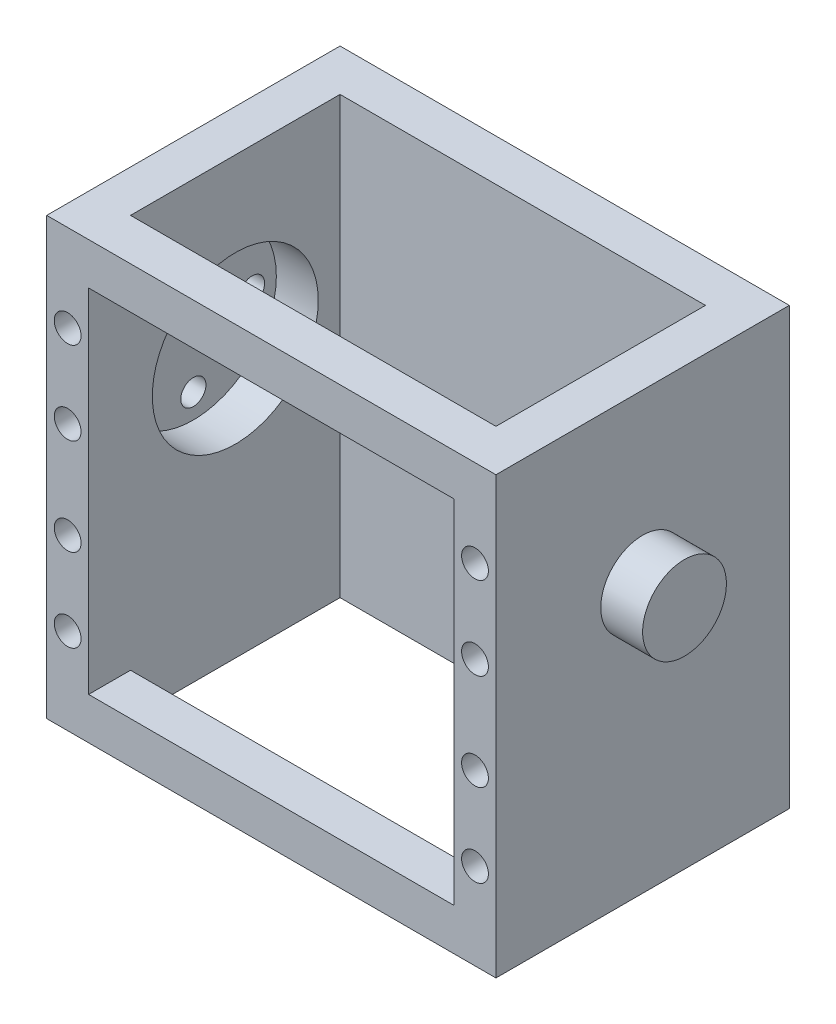
ISO-10303-21;
HEADER;
FILE_DESCRIPTION(('STEP AP214'),'2;1');
FILE_NAME('part.step','',(''),(''),'','','');
FILE_SCHEMA(('AUTOMOTIVE_DESIGN { 1 0 10303 214 1 1 1 1 }'));
ENDSEC;
DATA;
#1=APPLICATION_CONTEXT('core data for automotive mechanical design processes');
#2=APPLICATION_PROTOCOL_DEFINITION('international standard','automotive_design',2000,#1);
#3=PRODUCT_CONTEXT('',#1,'mechanical');
#4=PRODUCT('Part','Part','',(#3));
#5=PRODUCT_RELATED_PRODUCT_CATEGORY('part','',(#4));
#6=PRODUCT_DEFINITION_FORMATION('','',#4);
#7=PRODUCT_DEFINITION_CONTEXT('part definition',#1,'design');
#8=PRODUCT_DEFINITION('design','',#6,#7);
#9=PRODUCT_DEFINITION_SHAPE('','',#8);
#10=(LENGTH_UNIT() NAMED_UNIT(*) SI_UNIT(.MILLI.,.METRE.));
#11=(NAMED_UNIT(*) PLANE_ANGLE_UNIT() SI_UNIT($,.RADIAN.));
#12=(NAMED_UNIT(*) SI_UNIT($,.STERADIAN.) SOLID_ANGLE_UNIT());
#13=UNCERTAINTY_MEASURE_WITH_UNIT(LENGTH_MEASURE(1.E-05),#10,'distance_accuracy_value','');
#14=(GEOMETRIC_REPRESENTATION_CONTEXT(3) GLOBAL_UNCERTAINTY_ASSIGNED_CONTEXT((#13)) GLOBAL_UNIT_ASSIGNED_CONTEXT((#10,
#11,#12)) REPRESENTATION_CONTEXT('',''));
#15=CARTESIAN_POINT('',(0.,0.,0.));
#16=DIRECTION('',(0.,0.,1.));
#17=DIRECTION('',(1.,0.,0.));
#18=AXIS2_PLACEMENT_3D('',#15,#16,#17);
#19=CARTESIAN_POINT('',(5.,52.,30.));
#20=DIRECTION('',(0.,0.,-1.));
#21=DIRECTION('',(-1.,0.,0.));
#22=AXIS2_PLACEMENT_3D('',#19,#20,#21);
#23=PLANE('',#22);
#24=DIRECTION('',(-1.,0.,0.));
#25=VECTOR('',#24,1.);
#26=CARTESIAN_POINT('',(5.,47.,30.));
#27=LINE('',#26,#25);
#28=CARTESIAN_POINT('',(48.6,47.,30.));
#29=VERTEX_POINT('',#28);
#30=CARTESIAN_POINT('',(5.,47.,30.));
#31=VERTEX_POINT('',#30);
#32=EDGE_CURVE('E182',#29,#31,#27,.T.);
#33=ORIENTED_EDGE('',*,*,#32,.T.);
#34=DIRECTION('',(0.,-1.,0.));
#35=VECTOR('',#34,1.);
#36=CARTESIAN_POINT('',(5.,52.,30.));
#37=LINE('',#36,#35);
#38=CARTESIAN_POINT('',(5.,52.,30.));
#39=VERTEX_POINT('',#38);
#40=EDGE_CURVE('E185',#39,#31,#37,.T.);
#41=ORIENTED_EDGE('',*,*,#40,.F.);
#42=DIRECTION('',(1.,0.,0.));
#43=VECTOR('',#42,1.);
#44=CARTESIAN_POINT('',(5.,52.,30.));
#45=LINE('',#44,#43);
#46=CARTESIAN_POINT('',(48.6,52.,30.));
#47=VERTEX_POINT('',#46);
#48=EDGE_CURVE('E179',#39,#47,#45,.T.);
#49=ORIENTED_EDGE('',*,*,#48,.T.);
#50=DIRECTION('',(0.,-1.,0.));
#51=VECTOR('',#50,1.);
#52=CARTESIAN_POINT('',(48.6,52.,30.));
#53=LINE('',#52,#51);
#54=EDGE_CURVE('E181',#47,#29,#53,.T.);
#55=ORIENTED_EDGE('',*,*,#54,.T.);
#56=EDGE_LOOP('',(#33,#41,#49,#55));
#57=FACE_BOUND('',#56,.T.);
#58=ADVANCED_FACE('F43',(#57),#23,.T.);
#59=CARTESIAN_POINT('',(0.,52.,0.));
#60=DIRECTION('',(0.,1.,0.));
#61=DIRECTION('',(0.,0.,1.));
#62=AXIS2_PLACEMENT_3D('',#59,#60,#61);
#63=PLANE('',#62);
#64=DIRECTION('',(0.,0.,1.));
#65=VECTOR('',#64,1.);
#66=CARTESIAN_POINT('',(0.,52.,0.));
#67=LINE('',#66,#65);
#68=CARTESIAN_POINT('',(0.,52.,0.));
#69=VERTEX_POINT('',#68);
#70=CARTESIAN_POINT('',(0.,52.,35.));
#71=VERTEX_POINT('',#70);
#72=EDGE_CURVE('E269',#69,#71,#67,.T.);
#73=ORIENTED_EDGE('',*,*,#72,.T.);
#74=DIRECTION('',(1.,0.,0.));
#75=VECTOR('',#74,1.);
#76=CARTESIAN_POINT('',(0.,52.,35.));
#77=LINE('',#76,#75);
#78=CARTESIAN_POINT('',(53.6,52.,35.));
#79=VERTEX_POINT('',#78);
#80=EDGE_CURVE('E272',#71,#79,#77,.T.);
#81=ORIENTED_EDGE('',*,*,#80,.T.);
#82=DIRECTION('',(0.,0.,-1.));
#83=VECTOR('',#82,1.);
#84=CARTESIAN_POINT('',(53.6,52.,0.));
#85=LINE('',#84,#83);
#86=CARTESIAN_POINT('',(53.6,52.,0.));
#87=VERTEX_POINT('',#86);
#88=EDGE_CURVE('E284',#79,#87,#85,.T.);
#89=ORIENTED_EDGE('',*,*,#88,.T.);
#90=DIRECTION('',(-1.,0.,0.));
#91=VECTOR('',#90,1.);
#92=CARTESIAN_POINT('',(0.,52.,0.));
#93=LINE('',#92,#91);
#94=EDGE_CURVE('E175',#87,#69,#93,.T.);
#95=ORIENTED_EDGE('',*,*,#94,.T.);
#96=EDGE_LOOP('',(#73,#81,#89,#95));
#97=FACE_BOUND('',#96,.T.);
#98=ORIENTED_EDGE('',*,*,#48,.F.);
#99=DIRECTION('',(0.,0.,1.));
#100=VECTOR('',#99,1.);
#101=CARTESIAN_POINT('',(5.,52.,5.));
#102=LINE('',#101,#100);
#103=CARTESIAN_POINT('',(5.,52.,5.));
#104=VERTEX_POINT('',#103);
#105=EDGE_CURVE('E183',#104,#39,#102,.T.);
#106=ORIENTED_EDGE('',*,*,#105,.F.);
#107=DIRECTION('',(-1.,0.,0.));
#108=VECTOR('',#107,1.);
#109=CARTESIAN_POINT('',(5.,52.,5.));
#110=LINE('',#109,#108);
#111=CARTESIAN_POINT('',(48.6,52.,5.));
#112=VERTEX_POINT('',#111);
#113=EDGE_CURVE('E156',#112,#104,#110,.T.);
#114=ORIENTED_EDGE('',*,*,#113,.F.);
#115=DIRECTION('',(0.,0.,-1.));
#116=VECTOR('',#115,1.);
#117=CARTESIAN_POINT('',(48.6,52.,5.));
#118=LINE('',#117,#116);
#119=EDGE_CURVE('E153',#47,#112,#118,.T.);
#120=ORIENTED_EDGE('',*,*,#119,.F.);
#121=EDGE_LOOP('',(#98,#106,#114,#120));
#122=FACE_BOUND('',#121,.T.);
#123=ADVANCED_FACE('F265',(#97,#122),#63,.T.);
#124=CARTESIAN_POINT('',(0.,0.,0.));
#125=DIRECTION('',(0.,1.,0.));
#126=DIRECTION('',(0.,0.,1.));
#127=AXIS2_PLACEMENT_3D('',#124,#125,#126);
#128=PLANE('',#127);
#129=DIRECTION('',(0.,0.,1.));
#130=VECTOR('',#129,1.);
#131=CARTESIAN_POINT('',(0.,0.,0.));
#132=LINE('',#131,#130);
#133=CARTESIAN_POINT('',(0.,0.,0.));
#134=VERTEX_POINT('',#133);
#135=CARTESIAN_POINT('',(0.,0.,35.));
#136=VERTEX_POINT('',#135);
#137=EDGE_CURVE('E287',#134,#136,#132,.T.);
#138=ORIENTED_EDGE('',*,*,#137,.F.);
#139=DIRECTION('',(-1.,0.,0.));
#140=VECTOR('',#139,1.);
#141=CARTESIAN_POINT('',(0.,0.,0.));
#142=LINE('',#141,#140);
#143=CARTESIAN_POINT('',(53.6,0.,0.));
#144=VERTEX_POINT('',#143);
#145=EDGE_CURVE('E297',#144,#134,#142,.T.);
#146=ORIENTED_EDGE('',*,*,#145,.F.);
#147=DIRECTION('',(0.,0.,-1.));
#148=VECTOR('',#147,1.);
#149=CARTESIAN_POINT('',(53.6,0.,0.));
#150=LINE('',#149,#148);
#151=CARTESIAN_POINT('',(53.6,0.,35.));
#152=VERTEX_POINT('',#151);
#153=EDGE_CURVE('E294',#152,#144,#150,.T.);
#154=ORIENTED_EDGE('',*,*,#153,.F.);
#155=DIRECTION('',(1.,0.,0.));
#156=VECTOR('',#155,1.);
#157=CARTESIAN_POINT('',(0.,0.,35.));
#158=LINE('',#157,#156);
#159=EDGE_CURVE('E291',#136,#152,#158,.T.);
#160=ORIENTED_EDGE('',*,*,#159,.F.);
#161=EDGE_LOOP('',(#138,#146,#154,#160));
#162=FACE_BOUND('',#161,.T.);
#163=DIRECTION('',(0.,0.,1.));
#164=VECTOR('',#163,1.);
#165=CARTESIAN_POINT('',(5.,0.,5.));
#166=LINE('',#165,#164);
#167=CARTESIAN_POINT('',(5.,0.,5.));
#168=VERTEX_POINT('',#167);
#169=CARTESIAN_POINT('',(5.,0.,30.));
#170=VERTEX_POINT('',#169);
#171=EDGE_CURVE('E170',#168,#170,#166,.T.);
#172=ORIENTED_EDGE('',*,*,#171,.T.);
#173=DIRECTION('',(1.,0.,0.));
#174=VECTOR('',#173,1.);
#175=CARTESIAN_POINT('',(5.,0.,30.));
#176=LINE('',#175,#174);
#177=CARTESIAN_POINT('',(48.6,0.,30.));
#178=VERTEX_POINT('',#177);
#179=EDGE_CURVE('E168',#170,#178,#176,.T.);
#180=ORIENTED_EDGE('',*,*,#179,.T.);
#181=DIRECTION('',(0.,0.,-1.));
#182=VECTOR('',#181,1.);
#183=CARTESIAN_POINT('',(48.6,0.,5.));
#184=LINE('',#183,#182);
#185=CARTESIAN_POINT('',(48.6,0.,5.));
#186=VERTEX_POINT('',#185);
#187=EDGE_CURVE('E149',#178,#186,#184,.T.);
#188=ORIENTED_EDGE('',*,*,#187,.T.);
#189=DIRECTION('',(-1.,0.,0.));
#190=VECTOR('',#189,1.);
#191=CARTESIAN_POINT('',(5.,0.,5.));
#192=LINE('',#191,#190);
#193=EDGE_CURVE('E160',#186,#168,#192,.T.);
#194=ORIENTED_EDGE('',*,*,#193,.T.);
#195=EDGE_LOOP('',(#172,#180,#188,#194));
#196=FACE_BOUND('',#195,.T.);
#197=ADVANCED_FACE('F167',(#162,#196),#128,.F.);
#198=CARTESIAN_POINT('',(0.,52.,0.));
#199=DIRECTION('',(1.,0.,0.));
#200=DIRECTION('',(0.,0.,-1.));
#201=AXIS2_PLACEMENT_3D('',#198,#199,#200);
#202=PLANE('',#201);
#203=CARTESIAN_POINT('',(0.,32.,17.5));
#204=DIRECTION('',(1.,0.,0.));
#205=DIRECTION('',(0.,0.,-1.));
#206=AXIS2_PLACEMENT_3D('',#203,#204,#205);
#207=CIRCLE('',#206,9.9);
#208=CARTESIAN_POINT('',(0.,32.,7.6));
#209=VERTEX_POINT('',#208);
#210=EDGE_CURVE('E47',#209,#209,#207,.T.);
#211=ORIENTED_EDGE('',*,*,#210,.T.);
#212=EDGE_LOOP('',(#211));
#213=FACE_BOUND('',#212,.T.);
#214=ORIENTED_EDGE('',*,*,#137,.T.);
#215=DIRECTION('',(0.,-1.,0.));
#216=VECTOR('',#215,1.);
#217=CARTESIAN_POINT('',(0.,52.,35.));
#218=LINE('',#217,#216);
#219=EDGE_CURVE('E293',#71,#136,#218,.T.);
#220=ORIENTED_EDGE('',*,*,#219,.F.);
#221=ORIENTED_EDGE('',*,*,#72,.F.);
#222=DIRECTION('',(0.,-1.,0.));
#223=VECTOR('',#222,1.);
#224=CARTESIAN_POINT('',(0.,52.,0.));
#225=LINE('',#224,#223);
#226=EDGE_CURVE('E290',#69,#134,#225,.T.);
#227=ORIENTED_EDGE('',*,*,#226,.T.);
#228=EDGE_LOOP('',(#214,#220,#221,#227));
#229=FACE_BOUND('',#228,.T.);
#230=ADVANCED_FACE('F334',(#213,#229),#202,.F.);
#231=CARTESIAN_POINT('',(0.,52.,35.));
#232=DIRECTION('',(0.,0.,-1.));
#233=DIRECTION('',(-1.,0.,0.));
#234=AXIS2_PLACEMENT_3D('',#231,#232,#233);
#235=PLANE('',#234);
#236=CARTESIAN_POINT('',(51.1,20.2,35.));
#237=DIRECTION('',(0.,0.,1.));
#238=DIRECTION('',(1.,0.,0.));
#239=AXIS2_PLACEMENT_3D('',#236,#237,#238);
#240=CIRCLE('',#239,1.6);
#241=CARTESIAN_POINT('',(52.7,20.2,35.));
#242=VERTEX_POINT('',#241);
#243=EDGE_CURVE('E243',#242,#242,#240,.T.);
#244=ORIENTED_EDGE('',*,*,#243,.F.);
#245=EDGE_LOOP('',(#244));
#246=FACE_BOUND('',#245,.T.);
#247=CARTESIAN_POINT('',(51.1,10.3,35.));
#248=DIRECTION('',(0.,0.,1.));
#249=DIRECTION('',(1.,0.,0.));
#250=AXIS2_PLACEMENT_3D('',#247,#248,#249);
#251=CIRCLE('',#250,1.6);
#252=CARTESIAN_POINT('',(52.7,10.3,35.));
#253=VERTEX_POINT('',#252);
#254=EDGE_CURVE('E237',#253,#253,#251,.T.);
#255=ORIENTED_EDGE('',*,*,#254,.F.);
#256=EDGE_LOOP('',(#255));
#257=FACE_BOUND('',#256,.T.);
#258=CARTESIAN_POINT('',(2.5,10.3,35.));
#259=DIRECTION('',(0.,0.,1.));
#260=DIRECTION('',(1.,0.,0.));
#261=AXIS2_PLACEMENT_3D('',#258,#259,#260);
#262=CIRCLE('',#261,1.6);
#263=CARTESIAN_POINT('',(4.1,10.3,35.));
#264=VERTEX_POINT('',#263);
#265=EDGE_CURVE('E231',#264,#264,#262,.T.);
#266=ORIENTED_EDGE('',*,*,#265,.F.);
#267=EDGE_LOOP('',(#266));
#268=FACE_BOUND('',#267,.T.);
#269=CARTESIAN_POINT('',(2.5,20.2,35.));
#270=DIRECTION('',(0.,0.,1.));
#271=DIRECTION('',(1.,0.,0.));
#272=AXIS2_PLACEMENT_3D('',#269,#270,#271);
#273=CIRCLE('',#272,1.6);
#274=CARTESIAN_POINT('',(4.1,20.2,35.));
#275=VERTEX_POINT('',#274);
#276=EDGE_CURVE('E221',#275,#275,#273,.T.);
#277=ORIENTED_EDGE('',*,*,#276,.F.);
#278=EDGE_LOOP('',(#277));
#279=FACE_BOUND('',#278,.T.);
#280=CARTESIAN_POINT('',(2.5,31.7,35.));
#281=DIRECTION('',(0.,0.,1.));
#282=DIRECTION('',(1.,0.,0.));
#283=AXIS2_PLACEMENT_3D('',#280,#281,#282);
#284=CIRCLE('',#283,1.6);
#285=CARTESIAN_POINT('',(4.1,31.7,35.));
#286=VERTEX_POINT('',#285);
#287=EDGE_CURVE('E214',#286,#286,#284,.T.);
#288=ORIENTED_EDGE('',*,*,#287,.F.);
#289=EDGE_LOOP('',(#288));
#290=FACE_BOUND('',#289,.T.);
#291=CARTESIAN_POINT('',(51.1,31.7,35.));
#292=DIRECTION('',(0.,0.,1.));
#293=DIRECTION('',(1.,0.,0.));
#294=AXIS2_PLACEMENT_3D('',#291,#292,#293);
#295=CIRCLE('',#294,1.60000000000001);
#296=CARTESIAN_POINT('',(52.7,31.7,35.));
#297=VERTEX_POINT('',#296);
#298=EDGE_CURVE('E213',#297,#297,#295,.T.);
#299=ORIENTED_EDGE('',*,*,#298,.F.);
#300=EDGE_LOOP('',(#299));
#301=FACE_BOUND('',#300,.T.);
#302=CARTESIAN_POINT('',(51.1,41.6,35.));
#303=DIRECTION('',(0.,0.,1.));
#304=DIRECTION('',(1.,0.,0.));
#305=AXIS2_PLACEMENT_3D('',#302,#303,#304);
#306=CIRCLE('',#305,1.59999999999999);
#307=CARTESIAN_POINT('',(52.7,41.6,35.));
#308=VERTEX_POINT('',#307);
#309=EDGE_CURVE('E206',#308,#308,#306,.T.);
#310=ORIENTED_EDGE('',*,*,#309,.F.);
#311=EDGE_LOOP('',(#310));
#312=FACE_BOUND('',#311,.T.);
#313=CARTESIAN_POINT('',(2.5,41.6,35.));
#314=DIRECTION('',(0.,0.,1.));
#315=DIRECTION('',(1.,0.,0.));
#316=AXIS2_PLACEMENT_3D('',#313,#314,#315);
#317=CIRCLE('',#316,1.59999999999999);
#318=CARTESIAN_POINT('',(4.09999999999999,41.6,35.));
#319=VERTEX_POINT('',#318);
#320=EDGE_CURVE('E200',#319,#319,#317,.T.);
#321=ORIENTED_EDGE('',*,*,#320,.F.);
#322=EDGE_LOOP('',(#321));
#323=FACE_BOUND('',#322,.T.);
#324=DIRECTION('',(1.,0.,0.));
#325=VECTOR('',#324,1.);
#326=CARTESIAN_POINT('',(5.00000000000001,5.,35.));
#327=LINE('',#326,#325);
#328=CARTESIAN_POINT('',(5.00000000000001,5.,35.));
#329=VERTEX_POINT('',#328);
#330=CARTESIAN_POINT('',(48.6,5.,35.));
#331=VERTEX_POINT('',#330);
#332=EDGE_CURVE('E62',#329,#331,#327,.T.);
#333=ORIENTED_EDGE('',*,*,#332,.F.);
#334=DIRECTION('',(0.,-1.,0.));
#335=VECTOR('',#334,1.);
#336=CARTESIAN_POINT('',(5.,47.,35.));
#337=LINE('',#336,#335);
#338=CARTESIAN_POINT('',(5.,47.,35.));
#339=VERTEX_POINT('',#338);
#340=EDGE_CURVE('E111',#339,#329,#337,.T.);
#341=ORIENTED_EDGE('',*,*,#340,.F.);
#342=DIRECTION('',(-1.,0.,0.));
#343=VECTOR('',#342,1.);
#344=CARTESIAN_POINT('',(5.,47.,35.));
#345=LINE('',#344,#343);
#346=CARTESIAN_POINT('',(48.6,47.,35.));
#347=VERTEX_POINT('',#346);
#348=EDGE_CURVE('E194',#347,#339,#345,.T.);
#349=ORIENTED_EDGE('',*,*,#348,.F.);
#350=DIRECTION('',(0.,1.,0.));
#351=VECTOR('',#350,1.);
#352=CARTESIAN_POINT('',(48.6,47.,35.));
#353=LINE('',#352,#351);
#354=EDGE_CURVE('E178',#331,#347,#353,.T.);
#355=ORIENTED_EDGE('',*,*,#354,.F.);
#356=EDGE_LOOP('',(#333,#341,#349,#355));
#357=FACE_BOUND('',#356,.T.);
#358=ORIENTED_EDGE('',*,*,#159,.T.);
#359=DIRECTION('',(0.,-1.,0.));
#360=VECTOR('',#359,1.);
#361=CARTESIAN_POINT('',(53.6,52.,35.));
#362=LINE('',#361,#360);
#363=EDGE_CURVE('E296',#79,#152,#362,.T.);
#364=ORIENTED_EDGE('',*,*,#363,.F.);
#365=ORIENTED_EDGE('',*,*,#80,.F.);
#366=ORIENTED_EDGE('',*,*,#219,.T.);
#367=EDGE_LOOP('',(#358,#364,#365,#366));
#368=FACE_BOUND('',#367,.T.);
#369=ADVANCED_FACE('F278',(#246,#257,#268,#279,#290,#301,#312,#323,#357,#368),#235,.F.);
#370=CARTESIAN_POINT('',(53.6,52.,0.));
#371=DIRECTION('',(-1.,0.,0.));
#372=DIRECTION('',(0.,0.,1.));
#373=AXIS2_PLACEMENT_3D('',#370,#371,#372);
#374=PLANE('',#373);
#375=CARTESIAN_POINT('',(53.6,32.,17.5));
#376=DIRECTION('',(1.,0.,0.));
#377=DIRECTION('',(0.,0.,-1.));
#378=AXIS2_PLACEMENT_3D('',#375,#376,#377);
#379=CIRCLE('',#378,5.);
#380=CARTESIAN_POINT('',(53.6,32.,12.5));
#381=VERTEX_POINT('',#380);
#382=EDGE_CURVE('E12',#381,#381,#379,.T.);
#383=ORIENTED_EDGE('',*,*,#382,.F.);
#384=EDGE_LOOP('',(#383));
#385=FACE_BOUND('',#384,.T.);
#386=ORIENTED_EDGE('',*,*,#153,.T.);
#387=DIRECTION('',(0.,-1.,0.));
#388=VECTOR('',#387,1.);
#389=CARTESIAN_POINT('',(53.6,52.,0.));
#390=LINE('',#389,#388);
#391=EDGE_CURVE('E186',#87,#144,#390,.T.);
#392=ORIENTED_EDGE('',*,*,#391,.F.);
#393=ORIENTED_EDGE('',*,*,#88,.F.);
#394=ORIENTED_EDGE('',*,*,#363,.T.);
#395=EDGE_LOOP('',(#386,#392,#393,#394));
#396=FACE_BOUND('',#395,.T.);
#397=ADVANCED_FACE('F318',(#385,#396),#374,.F.);
#398=CARTESIAN_POINT('',(0.,52.,0.));
#399=DIRECTION('',(0.,0.,1.));
#400=DIRECTION('',(1.,0.,0.));
#401=AXIS2_PLACEMENT_3D('',#398,#399,#400);
#402=PLANE('',#401);
#403=ORIENTED_EDGE('',*,*,#145,.T.);
#404=ORIENTED_EDGE('',*,*,#226,.F.);
#405=ORIENTED_EDGE('',*,*,#94,.F.);
#406=ORIENTED_EDGE('',*,*,#391,.T.);
#407=EDGE_LOOP('',(#403,#404,#405,#406));
#408=FACE_BOUND('',#407,.T.);
#409=ADVANCED_FACE('F259',(#408),#402,.F.);
#410=CARTESIAN_POINT('',(5.,52.,5.));
#411=DIRECTION('',(1.,0.,0.));
#412=DIRECTION('',(0.,0.,-1.));
#413=AXIS2_PLACEMENT_3D('',#410,#411,#412);
#414=PLANE('',#413);
#415=CARTESIAN_POINT('',(5.,32.,17.5));
#416=DIRECTION('',(1.,0.,0.));
#417=DIRECTION('',(0.,0.,-1.));
#418=AXIS2_PLACEMENT_3D('',#415,#416,#417);
#419=CIRCLE('',#418,9.9);
#420=CARTESIAN_POINT('',(5.,32.,7.6));
#421=VERTEX_POINT('',#420);
#422=EDGE_CURVE('E53',#421,#421,#419,.T.);
#423=ORIENTED_EDGE('',*,*,#422,.F.);
#424=EDGE_LOOP('',(#423));
#425=FACE_BOUND('',#424,.T.);
#426=ORIENTED_EDGE('',*,*,#171,.F.);
#427=DIRECTION('',(0.,-1.,0.));
#428=VECTOR('',#427,1.);
#429=CARTESIAN_POINT('',(5.,52.,5.));
#430=LINE('',#429,#428);
#431=EDGE_CURVE('E163',#104,#168,#430,.T.);
#432=ORIENTED_EDGE('',*,*,#431,.F.);
#433=ORIENTED_EDGE('',*,*,#105,.T.);
#434=ORIENTED_EDGE('',*,*,#40,.T.);
#435=DIRECTION('',(0.,0.,1.));
#436=VECTOR('',#435,1.);
#437=CARTESIAN_POINT('',(5.,47.,30.));
#438=LINE('',#437,#436);
#439=EDGE_CURVE('E107',#31,#339,#438,.T.);
#440=ORIENTED_EDGE('',*,*,#439,.T.);
#441=ORIENTED_EDGE('',*,*,#340,.T.);
#442=DIRECTION('',(0.,0.,1.));
#443=VECTOR('',#442,1.);
#444=CARTESIAN_POINT('',(5.00000000000001,5.,30.));
#445=LINE('',#444,#443);
#446=CARTESIAN_POINT('',(5.00000000000001,5.,30.));
#447=VERTEX_POINT('',#446);
#448=EDGE_CURVE('E187',#447,#329,#445,.T.);
#449=ORIENTED_EDGE('',*,*,#448,.F.);
#450=EDGE_CURVE('E88',#447,#170,#37,.T.);
#451=ORIENTED_EDGE('',*,*,#450,.T.);
#452=EDGE_LOOP('',(#426,#432,#433,#434,#440,#441,#449,#451));
#453=FACE_BOUND('',#452,.T.);
#454=ADVANCED_FACE('F256',(#425,#453),#414,.T.);
#455=DIRECTION('',(1.,0.,0.));
#456=VECTOR('',#455,1.);
#457=CARTESIAN_POINT('',(5.00000000000001,5.,30.));
#458=LINE('',#457,#456);
#459=CARTESIAN_POINT('',(48.6,5.,30.));
#460=VERTEX_POINT('',#459);
#461=EDGE_CURVE('E80',#447,#460,#458,.T.);
#462=ORIENTED_EDGE('',*,*,#461,.T.);
#463=EDGE_CURVE('E192',#460,#178,#53,.T.);
#464=ORIENTED_EDGE('',*,*,#463,.T.);
#465=ORIENTED_EDGE('',*,*,#179,.F.);
#466=ORIENTED_EDGE('',*,*,#450,.F.);
#467=EDGE_LOOP('',(#462,#464,#465,#466));
#468=FACE_BOUND('',#467,.T.);
#469=ADVANCED_FACE('F258',(#468),#23,.T.);
#470=CARTESIAN_POINT('',(48.6,52.,5.));
#471=DIRECTION('',(-1.,0.,0.));
#472=DIRECTION('',(0.,0.,1.));
#473=AXIS2_PLACEMENT_3D('',#470,#471,#472);
#474=PLANE('',#473);
#475=ORIENTED_EDGE('',*,*,#187,.F.);
#476=ORIENTED_EDGE('',*,*,#463,.F.);
#477=DIRECTION('',(0.,0.,1.));
#478=VECTOR('',#477,1.);
#479=CARTESIAN_POINT('',(48.6,5.,30.));
#480=LINE('',#479,#478);
#481=EDGE_CURVE('E190',#460,#331,#480,.T.);
#482=ORIENTED_EDGE('',*,*,#481,.T.);
#483=ORIENTED_EDGE('',*,*,#354,.T.);
#484=DIRECTION('',(0.,0.,1.));
#485=VECTOR('',#484,1.);
#486=CARTESIAN_POINT('',(48.6,47.,30.));
#487=LINE('',#486,#485);
#488=EDGE_CURVE('E189',#29,#347,#487,.T.);
#489=ORIENTED_EDGE('',*,*,#488,.F.);
#490=ORIENTED_EDGE('',*,*,#54,.F.);
#491=ORIENTED_EDGE('',*,*,#119,.T.);
#492=DIRECTION('',(0.,-1.,0.));
#493=VECTOR('',#492,1.);
#494=CARTESIAN_POINT('',(48.6,52.,5.));
#495=LINE('',#494,#493);
#496=EDGE_CURVE('E144',#112,#186,#495,.T.);
#497=ORIENTED_EDGE('',*,*,#496,.T.);
#498=EDGE_LOOP('',(#475,#476,#482,#483,#489,#490,#491,#497));
#499=FACE_BOUND('',#498,.T.);
#500=ADVANCED_FACE('F146',(#499),#474,.T.);
#501=CARTESIAN_POINT('',(5.,52.,5.));
#502=DIRECTION('',(0.,0.,1.));
#503=DIRECTION('',(1.,0.,0.));
#504=AXIS2_PLACEMENT_3D('',#501,#502,#503);
#505=PLANE('',#504);
#506=ORIENTED_EDGE('',*,*,#193,.F.);
#507=ORIENTED_EDGE('',*,*,#496,.F.);
#508=ORIENTED_EDGE('',*,*,#113,.T.);
#509=ORIENTED_EDGE('',*,*,#431,.T.);
#510=EDGE_LOOP('',(#506,#507,#508,#509));
#511=FACE_BOUND('',#510,.T.);
#512=ADVANCED_FACE('F161',(#511),#505,.T.);
#513=CARTESIAN_POINT('',(5.,47.,30.));
#514=DIRECTION('',(0.,1.,0.));
#515=DIRECTION('',(0.,0.,1.));
#516=AXIS2_PLACEMENT_3D('',#513,#514,#515);
#517=PLANE('',#516);
#518=ORIENTED_EDGE('',*,*,#348,.T.);
#519=ORIENTED_EDGE('',*,*,#439,.F.);
#520=ORIENTED_EDGE('',*,*,#32,.F.);
#521=ORIENTED_EDGE('',*,*,#488,.T.);
#522=EDGE_LOOP('',(#518,#519,#520,#521));
#523=FACE_BOUND('',#522,.T.);
#524=ADVANCED_FACE('F281',(#523),#517,.F.);
#525=CARTESIAN_POINT('',(5.00000000000001,5.,30.));
#526=DIRECTION('',(0.,-1.,0.));
#527=DIRECTION('',(0.,0.,-1.));
#528=AXIS2_PLACEMENT_3D('',#525,#526,#527);
#529=PLANE('',#528);
#530=ORIENTED_EDGE('',*,*,#481,.F.);
#531=ORIENTED_EDGE('',*,*,#461,.F.);
#532=ORIENTED_EDGE('',*,*,#448,.T.);
#533=ORIENTED_EDGE('',*,*,#332,.T.);
#534=EDGE_LOOP('',(#530,#531,#532,#533));
#535=FACE_BOUND('',#534,.T.);
#536=ADVANCED_FACE('F363',(#535),#529,.F.);
#537=CARTESIAN_POINT('',(2.5,41.6,30.));
#538=DIRECTION('',(0.,0.,1.));
#539=DIRECTION('',(1.,0.,0.));
#540=AXIS2_PLACEMENT_3D('',#537,#538,#539);
#541=CYLINDRICAL_SURFACE('',#540,1.59999999999999);
#542=CARTESIAN_POINT('',(2.5,41.6,30.));
#543=DIRECTION('',(0.,0.,1.));
#544=DIRECTION('',(1.,0.,0.));
#545=AXIS2_PLACEMENT_3D('',#542,#543,#544);
#546=CIRCLE('',#545,1.59999999999999);
#547=CARTESIAN_POINT('',(4.09999999999999,41.6,30.));
#548=VERTEX_POINT('',#547);
#549=EDGE_CURVE('E210',#548,#548,#546,.T.);
#550=ORIENTED_EDGE('',*,*,#549,.F.);
#551=EDGE_LOOP('',(#550));
#552=FACE_BOUND('',#551,.T.);
#553=ORIENTED_EDGE('',*,*,#320,.T.);
#554=EDGE_LOOP('',(#553));
#555=FACE_BOUND('',#554,.T.);
#556=ADVANCED_FACE('F366',(#552,#555),#541,.F.);
#557=CARTESIAN_POINT('',(2.5,41.6,30.));
#558=DIRECTION('',(0.,0.,1.));
#559=DIRECTION('',(1.,0.,0.));
#560=AXIS2_PLACEMENT_3D('',#557,#558,#559);
#561=PLANE('',#560);
#562=ORIENTED_EDGE('',*,*,#549,.T.);
#563=EDGE_LOOP('',(#562));
#564=FACE_BOUND('',#563,.T.);
#565=ADVANCED_FACE('F373',(#564),#561,.T.);
#566=CARTESIAN_POINT('',(51.1,41.6,30.));
#567=DIRECTION('',(0.,0.,1.));
#568=DIRECTION('',(1.,0.,0.));
#569=AXIS2_PLACEMENT_3D('',#566,#567,#568);
#570=CYLINDRICAL_SURFACE('',#569,1.59999999999999);
#571=CARTESIAN_POINT('',(51.1,41.6,30.));
#572=DIRECTION('',(0.,0.,1.));
#573=DIRECTION('',(1.,0.,0.));
#574=AXIS2_PLACEMENT_3D('',#571,#572,#573);
#575=CIRCLE('',#574,1.59999999999999);
#576=CARTESIAN_POINT('',(52.7,41.6,30.));
#577=VERTEX_POINT('',#576);
#578=EDGE_CURVE('E209',#577,#577,#575,.T.);
#579=ORIENTED_EDGE('',*,*,#578,.F.);
#580=EDGE_LOOP('',(#579));
#581=FACE_BOUND('',#580,.T.);
#582=ORIENTED_EDGE('',*,*,#309,.T.);
#583=EDGE_LOOP('',(#582));
#584=FACE_BOUND('',#583,.T.);
#585=ADVANCED_FACE('F369',(#581,#584),#570,.F.);
#586=CARTESIAN_POINT('',(51.1,41.6,30.));
#587=DIRECTION('',(0.,0.,1.));
#588=DIRECTION('',(1.,0.,0.));
#589=AXIS2_PLACEMENT_3D('',#586,#587,#588);
#590=PLANE('',#589);
#591=ORIENTED_EDGE('',*,*,#578,.T.);
#592=EDGE_LOOP('',(#591));
#593=FACE_BOUND('',#592,.T.);
#594=ADVANCED_FACE('F372',(#593),#590,.T.);
#595=CARTESIAN_POINT('',(51.1,31.7,30.));
#596=DIRECTION('',(0.,0.,1.));
#597=DIRECTION('',(1.,0.,0.));
#598=AXIS2_PLACEMENT_3D('',#595,#596,#597);
#599=CYLINDRICAL_SURFACE('',#598,1.60000000000001);
#600=CARTESIAN_POINT('',(51.1,31.7,30.));
#601=DIRECTION('',(0.,0.,1.));
#602=DIRECTION('',(1.,0.,0.));
#603=AXIS2_PLACEMENT_3D('',#600,#601,#602);
#604=CIRCLE('',#603,1.60000000000001);
#605=CARTESIAN_POINT('',(52.7,31.7,30.));
#606=VERTEX_POINT('',#605);
#607=EDGE_CURVE('E218',#606,#606,#604,.T.);
#608=ORIENTED_EDGE('',*,*,#607,.F.);
#609=EDGE_LOOP('',(#608));
#610=FACE_BOUND('',#609,.T.);
#611=ORIENTED_EDGE('',*,*,#298,.T.);
#612=EDGE_LOOP('',(#611));
#613=FACE_BOUND('',#612,.T.);
#614=ADVANCED_FACE('F377',(#610,#613),#599,.F.);
#615=CARTESIAN_POINT('',(51.1,31.7,30.));
#616=DIRECTION('',(0.,0.,1.));
#617=DIRECTION('',(1.,0.,0.));
#618=AXIS2_PLACEMENT_3D('',#615,#616,#617);
#619=PLANE('',#618);
#620=ORIENTED_EDGE('',*,*,#607,.T.);
#621=EDGE_LOOP('',(#620));
#622=FACE_BOUND('',#621,.T.);
#623=ADVANCED_FACE('F383',(#622),#619,.T.);
#624=CARTESIAN_POINT('',(2.5,31.7,30.));
#625=DIRECTION('',(0.,0.,1.));
#626=DIRECTION('',(1.,0.,0.));
#627=AXIS2_PLACEMENT_3D('',#624,#625,#626);
#628=CYLINDRICAL_SURFACE('',#627,1.6);
#629=CARTESIAN_POINT('',(2.5,31.7,30.));
#630=DIRECTION('',(0.,0.,1.));
#631=DIRECTION('',(1.,0.,0.));
#632=AXIS2_PLACEMENT_3D('',#629,#630,#631);
#633=CIRCLE('',#632,1.6);
#634=CARTESIAN_POINT('',(4.1,31.7,30.));
#635=VERTEX_POINT('',#634);
#636=EDGE_CURVE('E217',#635,#635,#633,.T.);
#637=ORIENTED_EDGE('',*,*,#636,.F.);
#638=EDGE_LOOP('',(#637));
#639=FACE_BOUND('',#638,.T.);
#640=ORIENTED_EDGE('',*,*,#287,.T.);
#641=EDGE_LOOP('',(#640));
#642=FACE_BOUND('',#641,.T.);
#643=ADVANCED_FACE('F379',(#639,#642),#628,.F.);
#644=CARTESIAN_POINT('',(2.5,31.7,30.));
#645=DIRECTION('',(0.,0.,1.));
#646=DIRECTION('',(1.,0.,0.));
#647=AXIS2_PLACEMENT_3D('',#644,#645,#646);
#648=PLANE('',#647);
#649=ORIENTED_EDGE('',*,*,#636,.T.);
#650=EDGE_LOOP('',(#649));
#651=FACE_BOUND('',#650,.T.);
#652=ADVANCED_FACE('F382',(#651),#648,.T.);
#653=CARTESIAN_POINT('',(2.5,20.2,30.));
#654=DIRECTION('',(0.,0.,1.));
#655=DIRECTION('',(1.,0.,0.));
#656=AXIS2_PLACEMENT_3D('',#653,#654,#655);
#657=CYLINDRICAL_SURFACE('',#656,1.6);
#658=CARTESIAN_POINT('',(2.5,20.2,30.));
#659=DIRECTION('',(0.,0.,1.));
#660=DIRECTION('',(1.,0.,0.));
#661=AXIS2_PLACEMENT_3D('',#658,#659,#660);
#662=CIRCLE('',#661,1.6);
#663=CARTESIAN_POINT('',(4.1,20.2,30.));
#664=VERTEX_POINT('',#663);
#665=EDGE_CURVE('E228',#664,#664,#662,.T.);
#666=ORIENTED_EDGE('',*,*,#665,.F.);
#667=EDGE_LOOP('',(#666));
#668=FACE_BOUND('',#667,.T.);
#669=ORIENTED_EDGE('',*,*,#276,.T.);
#670=EDGE_LOOP('',(#669));
#671=FACE_BOUND('',#670,.T.);
#672=ADVANCED_FACE('F387',(#668,#671),#657,.F.);
#673=CARTESIAN_POINT('',(2.5,20.2,30.));
#674=DIRECTION('',(0.,0.,1.));
#675=DIRECTION('',(1.,0.,0.));
#676=AXIS2_PLACEMENT_3D('',#673,#674,#675);
#677=PLANE('',#676);
#678=ORIENTED_EDGE('',*,*,#665,.T.);
#679=EDGE_LOOP('',(#678));
#680=FACE_BOUND('',#679,.T.);
#681=ADVANCED_FACE('F397',(#680),#677,.T.);
#682=CARTESIAN_POINT('',(2.5,10.3,30.));
#683=DIRECTION('',(0.,0.,1.));
#684=DIRECTION('',(1.,0.,0.));
#685=AXIS2_PLACEMENT_3D('',#682,#683,#684);
#686=CYLINDRICAL_SURFACE('',#685,1.6);
#687=CARTESIAN_POINT('',(2.5,10.3,30.));
#688=DIRECTION('',(0.,0.,1.));
#689=DIRECTION('',(1.,0.,0.));
#690=AXIS2_PLACEMENT_3D('',#687,#688,#689);
#691=CIRCLE('',#690,1.6);
#692=CARTESIAN_POINT('',(4.1,10.3,30.));
#693=VERTEX_POINT('',#692);
#694=EDGE_CURVE('E234',#693,#693,#691,.T.);
#695=ORIENTED_EDGE('',*,*,#694,.F.);
#696=EDGE_LOOP('',(#695));
#697=FACE_BOUND('',#696,.T.);
#698=ORIENTED_EDGE('',*,*,#265,.T.);
#699=EDGE_LOOP('',(#698));
#700=FACE_BOUND('',#699,.T.);
#701=ADVANCED_FACE('F401',(#697,#700),#686,.F.);
#702=CARTESIAN_POINT('',(2.5,10.3,30.));
#703=DIRECTION('',(0.,0.,1.));
#704=DIRECTION('',(1.,0.,0.));
#705=AXIS2_PLACEMENT_3D('',#702,#703,#704);
#706=PLANE('',#705);
#707=ORIENTED_EDGE('',*,*,#694,.T.);
#708=EDGE_LOOP('',(#707));
#709=FACE_BOUND('',#708,.T.);
#710=ADVANCED_FACE('F405',(#709),#706,.T.);
#711=CARTESIAN_POINT('',(51.1,10.3,30.));
#712=DIRECTION('',(0.,0.,1.));
#713=DIRECTION('',(1.,0.,0.));
#714=AXIS2_PLACEMENT_3D('',#711,#712,#713);
#715=CYLINDRICAL_SURFACE('',#714,1.6);
#716=CARTESIAN_POINT('',(51.1,10.3,30.));
#717=DIRECTION('',(0.,0.,1.));
#718=DIRECTION('',(1.,0.,0.));
#719=AXIS2_PLACEMENT_3D('',#716,#717,#718);
#720=CIRCLE('',#719,1.6);
#721=CARTESIAN_POINT('',(52.7,10.3,30.));
#722=VERTEX_POINT('',#721);
#723=EDGE_CURVE('E240',#722,#722,#720,.T.);
#724=ORIENTED_EDGE('',*,*,#723,.F.);
#725=EDGE_LOOP('',(#724));
#726=FACE_BOUND('',#725,.T.);
#727=ORIENTED_EDGE('',*,*,#254,.T.);
#728=EDGE_LOOP('',(#727));
#729=FACE_BOUND('',#728,.T.);
#730=ADVANCED_FACE('F409',(#726,#729),#715,.F.);
#731=CARTESIAN_POINT('',(51.1,10.3,30.));
#732=DIRECTION('',(0.,0.,1.));
#733=DIRECTION('',(1.,0.,0.));
#734=AXIS2_PLACEMENT_3D('',#731,#732,#733);
#735=PLANE('',#734);
#736=ORIENTED_EDGE('',*,*,#723,.T.);
#737=EDGE_LOOP('',(#736));
#738=FACE_BOUND('',#737,.T.);
#739=ADVANCED_FACE('F413',(#738),#735,.T.);
#740=CARTESIAN_POINT('',(51.1,20.2,30.));
#741=DIRECTION('',(0.,0.,1.));
#742=DIRECTION('',(1.,0.,0.));
#743=AXIS2_PLACEMENT_3D('',#740,#741,#742);
#744=CYLINDRICAL_SURFACE('',#743,1.6);
#745=CARTESIAN_POINT('',(51.1,20.2,30.));
#746=DIRECTION('',(0.,0.,1.));
#747=DIRECTION('',(1.,0.,0.));
#748=AXIS2_PLACEMENT_3D('',#745,#746,#747);
#749=CIRCLE('',#748,1.6);
#750=CARTESIAN_POINT('',(52.7,20.2,30.));
#751=VERTEX_POINT('',#750);
#752=EDGE_CURVE('E246',#751,#751,#749,.T.);
#753=ORIENTED_EDGE('',*,*,#752,.F.);
#754=EDGE_LOOP('',(#753));
#755=FACE_BOUND('',#754,.T.);
#756=ORIENTED_EDGE('',*,*,#243,.T.);
#757=EDGE_LOOP('',(#756));
#758=FACE_BOUND('',#757,.T.);
#759=ADVANCED_FACE('F417',(#755,#758),#744,.F.);
#760=CARTESIAN_POINT('',(51.1,20.2,30.));
#761=DIRECTION('',(0.,0.,1.));
#762=DIRECTION('',(1.,0.,0.));
#763=AXIS2_PLACEMENT_3D('',#760,#761,#762);
#764=PLANE('',#763);
#765=ORIENTED_EDGE('',*,*,#752,.T.);
#766=EDGE_LOOP('',(#765));
#767=FACE_BOUND('',#766,.T.);
#768=ADVANCED_FACE('F421',(#767),#764,.T.);
#769=CARTESIAN_POINT('',(0.,32.,17.5));
#770=DIRECTION('',(1.,0.,0.));
#771=DIRECTION('',(0.,0.,-1.));
#772=AXIS2_PLACEMENT_3D('',#769,#770,#771);
#773=CYLINDRICAL_SURFACE('',#772,9.9);
#774=ORIENTED_EDGE('',*,*,#210,.F.);
#775=EDGE_LOOP('',(#774));
#776=FACE_BOUND('',#775,.T.);
#777=ORIENTED_EDGE('',*,*,#422,.T.);
#778=EDGE_LOOP('',(#777));
#779=FACE_BOUND('',#778,.T.);
#780=ADVANCED_FACE('F45',(#776,#779),#773,.F.);
#781=CARTESIAN_POINT('',(58.6,32.,17.5));
#782=DIRECTION('',(-1.,0.,0.));
#783=DIRECTION('',(0.,0.,1.));
#784=AXIS2_PLACEMENT_3D('',#781,#782,#783);
#785=CYLINDRICAL_SURFACE('',#784,5.);
#786=CARTESIAN_POINT('',(58.6,32.,17.5));
#787=DIRECTION('',(1.,0.,0.));
#788=DIRECTION('',(0.,0.,-1.));
#789=AXIS2_PLACEMENT_3D('',#786,#787,#788);
#790=CIRCLE('',#789,5.);
#791=CARTESIAN_POINT('',(58.6,32.,12.5));
#792=VERTEX_POINT('',#791);
#793=EDGE_CURVE('E204',#792,#792,#790,.T.);
#794=ORIENTED_EDGE('',*,*,#793,.F.);
#795=EDGE_LOOP('',(#794));
#796=FACE_BOUND('',#795,.T.);
#797=ORIENTED_EDGE('',*,*,#382,.T.);
#798=EDGE_LOOP('',(#797));
#799=FACE_BOUND('',#798,.T.);
#800=ADVANCED_FACE('F312',(#796,#799),#785,.T.);
#801=CARTESIAN_POINT('',(58.6,32.,17.5));
#802=DIRECTION('',(1.,0.,0.));
#803=DIRECTION('',(0.,0.,-1.));
#804=AXIS2_PLACEMENT_3D('',#801,#802,#803);
#805=PLANE('',#804);
#806=ORIENTED_EDGE('',*,*,#793,.T.);
#807=EDGE_LOOP('',(#806));
#808=FACE_BOUND('',#807,.T.);
#809=ADVANCED_FACE('F310',(#808),#805,.T.);
#810=CLOSED_SHELL('',(#58,#123,#197,#230,#369,#397,#409,#454,#469,#500,#512,#524,#536,#556,#565,
#585,#594,#614,#623,#643,#652,#672,#681,#701,#710,#730,#739,#759,#768,#780,#800,#809));
#811=MANIFOLD_SOLID_BREP('B2',#810);
#812=CARTESIAN_POINT('',(-3.,32.,17.5));
#813=DIRECTION('',(1.,0.,0.));
#814=DIRECTION('',(0.,0.,-1.));
#815=AXIS2_PLACEMENT_3D('',#812,#813,#814);
#816=CYLINDRICAL_SURFACE('',#815,1.5);
#817=CARTESIAN_POINT('',(-3.,32.,17.5));
#818=DIRECTION('',(-1.,0.,0.));
#819=DIRECTION('',(0.,0.,1.));
#820=AXIS2_PLACEMENT_3D('',#817,#818,#819);
#821=CIRCLE('',#820,1.5);
#822=CARTESIAN_POINT('',(-3.,32.,19.));
#823=VERTEX_POINT('',#822);
#824=EDGE_CURVE('E698',#823,#823,#821,.T.);
#825=ORIENTED_EDGE('',*,*,#824,.T.);
#826=EDGE_LOOP('',(#825));
#827=FACE_BOUND('',#826,.T.);
#828=CARTESIAN_POINT('',(0.,32.,17.5));
#829=DIRECTION('',(-1.,0.,0.));
#830=DIRECTION('',(0.,0.,1.));
#831=AXIS2_PLACEMENT_3D('',#828,#829,#830);
#832=CIRCLE('',#831,1.5);
#833=CARTESIAN_POINT('',(0.,32.,19.));
#834=VERTEX_POINT('',#833);
#835=EDGE_CURVE('E684',#834,#834,#832,.T.);
#836=ORIENTED_EDGE('',*,*,#835,.F.);
#837=EDGE_LOOP('',(#836));
#838=FACE_BOUND('',#837,.T.);
#839=ADVANCED_FACE('F662',(#827,#838),#816,.F.);
#840=CARTESIAN_POINT('',(-3.,25.,17.5));
#841=DIRECTION('',(1.,0.,0.));
#842=DIRECTION('',(0.,0.,-1.));
#843=AXIS2_PLACEMENT_3D('',#840,#841,#842);
#844=CYLINDRICAL_SURFACE('',#843,1.5);
#845=CARTESIAN_POINT('',(-3.,25.,17.5));
#846=DIRECTION('',(-1.,0.,0.));
#847=DIRECTION('',(0.,0.,1.));
#848=AXIS2_PLACEMENT_3D('',#845,#846,#847);
#849=CIRCLE('',#848,1.5);
#850=CARTESIAN_POINT('',(-3.,25.,19.));
#851=VERTEX_POINT('',#850);
#852=EDGE_CURVE('E678',#851,#851,#849,.T.);
#853=ORIENTED_EDGE('',*,*,#852,.T.);
#854=EDGE_LOOP('',(#853));
#855=FACE_BOUND('',#854,.T.);
#856=CARTESIAN_POINT('',(0.,25.,17.5));
#857=DIRECTION('',(-1.,0.,0.));
#858=DIRECTION('',(0.,0.,1.));
#859=AXIS2_PLACEMENT_3D('',#856,#857,#858);
#860=CIRCLE('',#859,1.5);
#861=CARTESIAN_POINT('',(0.,25.,19.));
#862=VERTEX_POINT('',#861);
#863=EDGE_CURVE('E688',#862,#862,#860,.T.);
#864=ORIENTED_EDGE('',*,*,#863,.F.);
#865=EDGE_LOOP('',(#864));
#866=FACE_BOUND('',#865,.T.);
#867=ADVANCED_FACE('F713',(#855,#866),#844,.F.);
#868=CARTESIAN_POINT('',(-3.,39.,17.5));
#869=DIRECTION('',(1.,0.,0.));
#870=DIRECTION('',(0.,0.,-1.));
#871=AXIS2_PLACEMENT_3D('',#868,#869,#870);
#872=CYLINDRICAL_SURFACE('',#871,1.5);
#873=CARTESIAN_POINT('',(-3.,39.,17.5));
#874=DIRECTION('',(-1.,0.,0.));
#875=DIRECTION('',(0.,0.,1.));
#876=AXIS2_PLACEMENT_3D('',#873,#874,#875);
#877=CIRCLE('',#876,1.5);
#878=CARTESIAN_POINT('',(-3.,39.,19.));
#879=VERTEX_POINT('',#878);
#880=EDGE_CURVE('E669',#879,#879,#877,.T.);
#881=ORIENTED_EDGE('',*,*,#880,.T.);
#882=EDGE_LOOP('',(#881));
#883=FACE_BOUND('',#882,.T.);
#884=CARTESIAN_POINT('',(0.,39.,17.5));
#885=DIRECTION('',(-1.,0.,0.));
#886=DIRECTION('',(0.,0.,1.));
#887=AXIS2_PLACEMENT_3D('',#884,#885,#886);
#888=CIRCLE('',#887,1.5);
#889=CARTESIAN_POINT('',(0.,39.,19.));
#890=VERTEX_POINT('',#889);
#891=EDGE_CURVE('E682',#890,#890,#888,.T.);
#892=ORIENTED_EDGE('',*,*,#891,.F.);
#893=EDGE_LOOP('',(#892));
#894=FACE_BOUND('',#893,.T.);
#895=ADVANCED_FACE('F715',(#883,#894),#872,.F.);
#896=CARTESIAN_POINT('',(-3.,32.,24.5));
#897=DIRECTION('',(1.,0.,0.));
#898=DIRECTION('',(0.,0.,-1.));
#899=AXIS2_PLACEMENT_3D('',#896,#897,#898);
#900=CYLINDRICAL_SURFACE('',#899,1.5);
#901=CARTESIAN_POINT('',(-3.,32.,24.5));
#902=DIRECTION('',(-1.,0.,0.));
#903=DIRECTION('',(0.,0.,1.));
#904=AXIS2_PLACEMENT_3D('',#901,#902,#903);
#905=CIRCLE('',#904,1.5);
#906=CARTESIAN_POINT('',(-3.,32.,26.));
#907=VERTEX_POINT('',#906);
#908=EDGE_CURVE('E673',#907,#907,#905,.T.);
#909=ORIENTED_EDGE('',*,*,#908,.T.);
#910=EDGE_LOOP('',(#909));
#911=FACE_BOUND('',#910,.T.);
#912=CARTESIAN_POINT('',(0.,32.,24.5));
#913=DIRECTION('',(-1.,0.,0.));
#914=DIRECTION('',(0.,0.,1.));
#915=AXIS2_PLACEMENT_3D('',#912,#913,#914);
#916=CIRCLE('',#915,1.5);
#917=CARTESIAN_POINT('',(0.,32.,26.));
#918=VERTEX_POINT('',#917);
#919=EDGE_CURVE('E681',#918,#918,#916,.T.);
#920=ORIENTED_EDGE('',*,*,#919,.F.);
#921=EDGE_LOOP('',(#920));
#922=FACE_BOUND('',#921,.T.);
#923=ADVANCED_FACE('F722',(#911,#922),#900,.F.);
#924=CARTESIAN_POINT('',(-3.,32.,10.5));
#925=DIRECTION('',(1.,0.,0.));
#926=DIRECTION('',(0.,0.,-1.));
#927=AXIS2_PLACEMENT_3D('',#924,#925,#926);
#928=CYLINDRICAL_SURFACE('',#927,1.5);
#929=CARTESIAN_POINT('',(-3.,32.,10.5));
#930=DIRECTION('',(-1.,0.,0.));
#931=DIRECTION('',(0.,0.,1.));
#932=AXIS2_PLACEMENT_3D('',#929,#930,#931);
#933=CIRCLE('',#932,1.5);
#934=CARTESIAN_POINT('',(-3.,32.,12.));
#935=VERTEX_POINT('',#934);
#936=EDGE_CURVE('E699',#935,#935,#933,.T.);
#937=ORIENTED_EDGE('',*,*,#936,.T.);
#938=EDGE_LOOP('',(#937));
#939=FACE_BOUND('',#938,.T.);
#940=CARTESIAN_POINT('',(0.,32.,10.5));
#941=DIRECTION('',(-1.,0.,0.));
#942=DIRECTION('',(0.,0.,1.));
#943=AXIS2_PLACEMENT_3D('',#940,#941,#942);
#944=CIRCLE('',#943,1.5);
#945=CARTESIAN_POINT('',(0.,32.,12.));
#946=VERTEX_POINT('',#945);
#947=EDGE_CURVE('E702',#946,#946,#944,.T.);
#948=ORIENTED_EDGE('',*,*,#947,.F.);
#949=EDGE_LOOP('',(#948));
#950=FACE_BOUND('',#949,.T.);
#951=ADVANCED_FACE('F728',(#939,#950),#928,.F.);
#952=CARTESIAN_POINT('',(-3.,32.,17.5));
#953=DIRECTION('',(-1.,0.,0.));
#954=DIRECTION('',(0.,0.,1.));
#955=AXIS2_PLACEMENT_3D('',#952,#953,#954);
#956=PLANE('',#955);
#957=ORIENTED_EDGE('',*,*,#936,.F.);
#958=EDGE_LOOP('',(#957));
#959=FACE_BOUND('',#958,.T.);
#960=ORIENTED_EDGE('',*,*,#908,.F.);
#961=EDGE_LOOP('',(#960));
#962=FACE_BOUND('',#961,.T.);
#963=CARTESIAN_POINT('',(-3.,32.,17.5));
#964=DIRECTION('',(-1.,0.,0.));
#965=DIRECTION('',(0.,0.,1.));
#966=AXIS2_PLACEMENT_3D('',#963,#964,#965);
#967=CIRCLE('',#966,9.9);
#968=CARTESIAN_POINT('',(-3.,32.,27.4));
#969=VERTEX_POINT('',#968);
#970=EDGE_CURVE('E42',#969,#969,#967,.T.);
#971=ORIENTED_EDGE('',*,*,#970,.T.);
#972=EDGE_LOOP('',(#971));
#973=FACE_BOUND('',#972,.T.);
#974=ORIENTED_EDGE('',*,*,#880,.F.);
#975=EDGE_LOOP('',(#974));
#976=FACE_BOUND('',#975,.T.);
#977=ORIENTED_EDGE('',*,*,#852,.F.);
#978=EDGE_LOOP('',(#977));
#979=FACE_BOUND('',#978,.T.);
#980=ORIENTED_EDGE('',*,*,#824,.F.);
#981=EDGE_LOOP('',(#980));
#982=FACE_BOUND('',#981,.T.);
#983=ADVANCED_FACE('F731',(#959,#962,#973,#976,#979,#982),#956,.T.);
#984=CARTESIAN_POINT('',(-3.,32.,17.5));
#985=DIRECTION('',(1.,0.,0.));
#986=DIRECTION('',(0.,0.,-1.));
#987=AXIS2_PLACEMENT_3D('',#984,#985,#986);
#988=CYLINDRICAL_SURFACE('',#987,9.9);
#989=ORIENTED_EDGE('',*,*,#970,.F.);
#990=EDGE_LOOP('',(#989));
#991=FACE_BOUND('',#990,.T.);
#992=CARTESIAN_POINT('',(0.,32.,17.5));
#993=DIRECTION('',(1.,0.,0.));
#994=DIRECTION('',(0.,0.,-1.));
#995=AXIS2_PLACEMENT_3D('',#992,#993,#994);
#996=CIRCLE('',#995,9.9);
#997=CARTESIAN_POINT('',(0.,32.,7.6));
#998=VERTEX_POINT('',#997);
#999=EDGE_CURVE('E690',#998,#998,#996,.T.);
#1000=ORIENTED_EDGE('',*,*,#999,.F.);
#1001=EDGE_LOOP('',(#1000));
#1002=FACE_BOUND('',#1001,.T.);
#1003=ADVANCED_FACE('F664',(#991,#1002),#988,.T.);
#1004=CARTESIAN_POINT('',(0.,32.,17.5));
#1005=DIRECTION('',(1.,0.,0.));
#1006=DIRECTION('',(0.,0.,-1.));
#1007=AXIS2_PLACEMENT_3D('',#1004,#1005,#1006);
#1008=PLANE('',#1007);
#1009=ORIENTED_EDGE('',*,*,#999,.T.);
#1010=EDGE_LOOP('',(#1009));
#1011=FACE_BOUND('',#1010,.T.);
#1012=ORIENTED_EDGE('',*,*,#835,.T.);
#1013=EDGE_LOOP('',(#1012));
#1014=FACE_BOUND('',#1013,.T.);
#1015=ORIENTED_EDGE('',*,*,#891,.T.);
#1016=EDGE_LOOP('',(#1015));
#1017=FACE_BOUND('',#1016,.T.);
#1018=ORIENTED_EDGE('',*,*,#919,.T.);
#1019=EDGE_LOOP('',(#1018));
#1020=FACE_BOUND('',#1019,.T.);
#1021=ORIENTED_EDGE('',*,*,#863,.T.);
#1022=EDGE_LOOP('',(#1021));
#1023=FACE_BOUND('',#1022,.T.);
#1024=ORIENTED_EDGE('',*,*,#947,.T.);
#1025=EDGE_LOOP('',(#1024));
#1026=FACE_BOUND('',#1025,.T.);
#1027=ADVANCED_FACE('F710',(#1011,#1014,#1017,#1020,#1023,#1026),#1008,.T.);
#1028=CLOSED_SHELL('',(#839,#867,#895,#923,#951,#983,#1003,#1027));
#1029=MANIFOLD_SOLID_BREP('B6',#1028);
#1030=ADVANCED_BREP_SHAPE_REPRESENTATION('',(#18,#811,#1029),#14);
#1031=SHAPE_DEFINITION_REPRESENTATION(#9,#1030);
ENDSEC;
END-ISO-10303-21;
